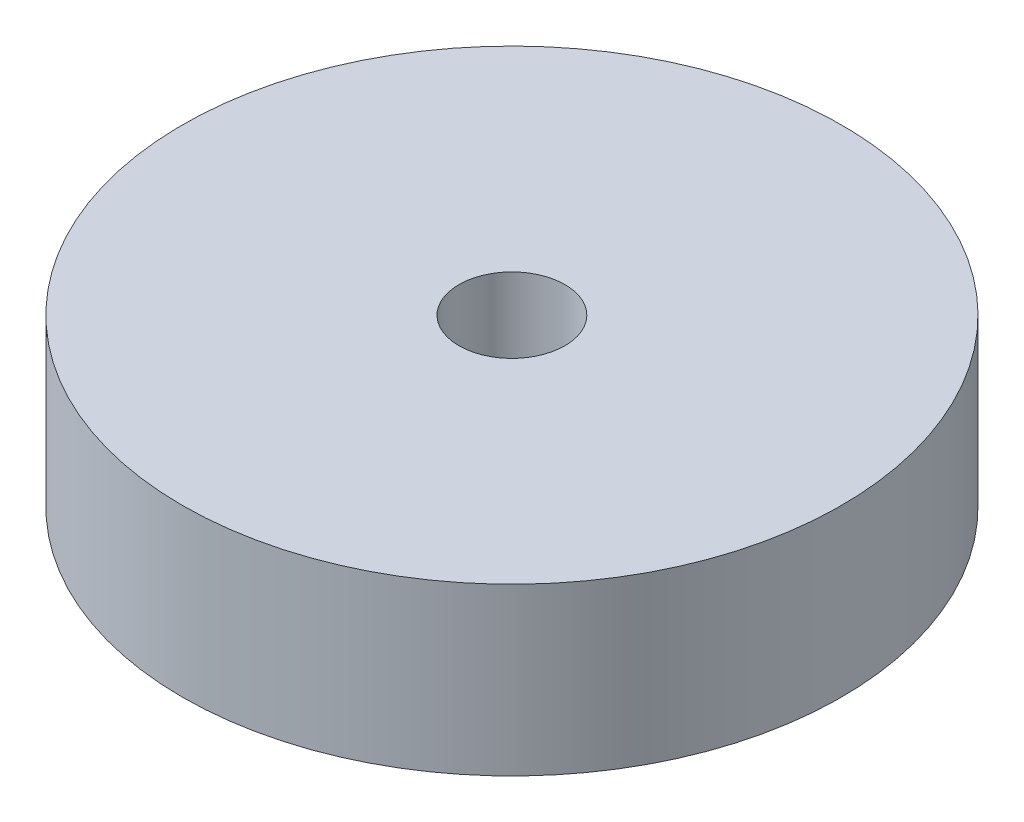
ISO-10303-21;
HEADER;
FILE_DESCRIPTION(('STEP AP214'),'2;1');
FILE_NAME('part.step','',(''),(''),'','','');
FILE_SCHEMA(('AUTOMOTIVE_DESIGN { 1 0 10303 214 1 1 1 1 }'));
ENDSEC;
DATA;
#1=APPLICATION_CONTEXT('core data for automotive mechanical design processes');
#2=APPLICATION_PROTOCOL_DEFINITION('international standard','automotive_design',2000,#1);
#3=PRODUCT_CONTEXT('',#1,'mechanical');
#4=PRODUCT('Part','Part','',(#3));
#5=PRODUCT_RELATED_PRODUCT_CATEGORY('part','',(#4));
#6=PRODUCT_DEFINITION_FORMATION('','',#4);
#7=PRODUCT_DEFINITION_CONTEXT('part definition',#1,'design');
#8=PRODUCT_DEFINITION('design','',#6,#7);
#9=PRODUCT_DEFINITION_SHAPE('','',#8);
#10=(LENGTH_UNIT() NAMED_UNIT(*) SI_UNIT(.MILLI.,.METRE.));
#11=(NAMED_UNIT(*) PLANE_ANGLE_UNIT() SI_UNIT($,.RADIAN.));
#12=(NAMED_UNIT(*) SI_UNIT($,.STERADIAN.) SOLID_ANGLE_UNIT());
#13=UNCERTAINTY_MEASURE_WITH_UNIT(LENGTH_MEASURE(1.E-05),#10,'distance_accuracy_value','');
#14=(GEOMETRIC_REPRESENTATION_CONTEXT(3) GLOBAL_UNCERTAINTY_ASSIGNED_CONTEXT((#13)) GLOBAL_UNIT_ASSIGNED_CONTEXT((#10,
#11,#12)) REPRESENTATION_CONTEXT('',''));
#15=CARTESIAN_POINT('',(0.,0.,0.));
#16=DIRECTION('',(0.,0.,1.));
#17=DIRECTION('',(1.,0.,0.));
#18=AXIS2_PLACEMENT_3D('',#15,#16,#17);
#19=CARTESIAN_POINT('',(0.,8.,0.));
#20=DIRECTION('',(0.,-1.,0.));
#21=DIRECTION('',(0.,0.,-1.));
#22=AXIS2_PLACEMENT_3D('',#19,#20,#21);
#23=CYLINDRICAL_SURFACE('',#22,15.875);
#24=CARTESIAN_POINT('',(0.,8.,0.));
#25=DIRECTION('',(0.,1.,0.));
#26=DIRECTION('',(0.,0.,1.));
#27=AXIS2_PLACEMENT_3D('',#24,#25,#26);
#28=CIRCLE('',#27,15.875);
#29=CARTESIAN_POINT('',(0.,8.,15.875));
#30=VERTEX_POINT('',#29);
#31=EDGE_CURVE('E10',#30,#30,#28,.T.);
#32=ORIENTED_EDGE('',*,*,#31,.F.);
#33=EDGE_LOOP('',(#32));
#34=FACE_BOUND('',#33,.T.);
#35=CARTESIAN_POINT('',(0.,0.,0.));
#36=DIRECTION('',(0.,1.,0.));
#37=DIRECTION('',(0.,0.,1.));
#38=AXIS2_PLACEMENT_3D('',#35,#36,#37);
#39=CIRCLE('',#38,15.875);
#40=CARTESIAN_POINT('',(0.,0.,15.875));
#41=VERTEX_POINT('',#40);
#42=EDGE_CURVE('E43',#41,#41,#39,.T.);
#43=ORIENTED_EDGE('',*,*,#42,.T.);
#44=EDGE_LOOP('',(#43));
#45=FACE_BOUND('',#44,.T.);
#46=ADVANCED_FACE('F40',(#34,#45),#23,.T.);
#47=CARTESIAN_POINT('',(0.,8.,0.));
#48=DIRECTION('',(0.,1.,0.));
#49=DIRECTION('',(0.,0.,1.));
#50=AXIS2_PLACEMENT_3D('',#47,#48,#49);
#51=PLANE('',#50);
#52=CARTESIAN_POINT('',(0.,8.,0.));
#53=DIRECTION('',(0.,1.,0.));
#54=DIRECTION('',(0.,0.,1.));
#55=AXIS2_PLACEMENT_3D('',#52,#53,#54);
#56=CIRCLE('',#55,2.55269999999999);
#57=CARTESIAN_POINT('',(0.,8.,2.55269999999999));
#58=VERTEX_POINT('',#57);
#59=EDGE_CURVE('E54',#58,#58,#56,.T.);
#60=ORIENTED_EDGE('',*,*,#59,.F.);
#61=EDGE_LOOP('',(#60));
#62=FACE_BOUND('',#61,.T.);
#63=ORIENTED_EDGE('',*,*,#31,.T.);
#64=EDGE_LOOP('',(#63));
#65=FACE_BOUND('',#64,.T.);
#66=ADVANCED_FACE('F60',(#62,#65),#51,.T.);
#67=CARTESIAN_POINT('',(0.,0.,0.));
#68=DIRECTION('',(0.,1.,0.));
#69=DIRECTION('',(0.,0.,1.));
#70=AXIS2_PLACEMENT_3D('',#67,#68,#69);
#71=PLANE('',#70);
#72=CARTESIAN_POINT('',(0.,0.,0.));
#73=DIRECTION('',(0.,1.,0.));
#74=DIRECTION('',(0.,0.,1.));
#75=AXIS2_PLACEMENT_3D('',#72,#73,#74);
#76=CIRCLE('',#75,2.5527);
#77=CARTESIAN_POINT('',(0.,0.,2.5527));
#78=VERTEX_POINT('',#77);
#79=EDGE_CURVE('E50',#78,#78,#76,.T.);
#80=ORIENTED_EDGE('',*,*,#79,.T.);
#81=EDGE_LOOP('',(#80));
#82=FACE_BOUND('',#81,.T.);
#83=ORIENTED_EDGE('',*,*,#42,.F.);
#84=EDGE_LOOP('',(#83));
#85=FACE_BOUND('',#84,.T.);
#86=ADVANCED_FACE('F62',(#82,#85),#71,.F.);
#87=CARTESIAN_POINT('',(0.,8.,0.));
#88=DIRECTION('',(0.,1.,0.));
#89=DIRECTION('',(0.,0.,1.));
#90=AXIS2_PLACEMENT_3D('',#87,#88,#89);
#91=CYLINDRICAL_SURFACE('',#90,2.55269999999999);
#92=ORIENTED_EDGE('',*,*,#79,.F.);
#93=EDGE_LOOP('',(#92));
#94=FACE_BOUND('',#93,.T.);
#95=ORIENTED_EDGE('',*,*,#59,.T.);
#96=EDGE_LOOP('',(#95));
#97=FACE_BOUND('',#96,.T.);
#98=ADVANCED_FACE('F58',(#94,#97),#91,.F.);
#99=CLOSED_SHELL('',(#46,#66,#86,#98));
#100=MANIFOLD_SOLID_BREP('B2',#99);
#101=ADVANCED_BREP_SHAPE_REPRESENTATION('',(#18,#100),#14);
#102=SHAPE_DEFINITION_REPRESENTATION(#9,#101);
ENDSEC;
END-ISO-10303-21;
